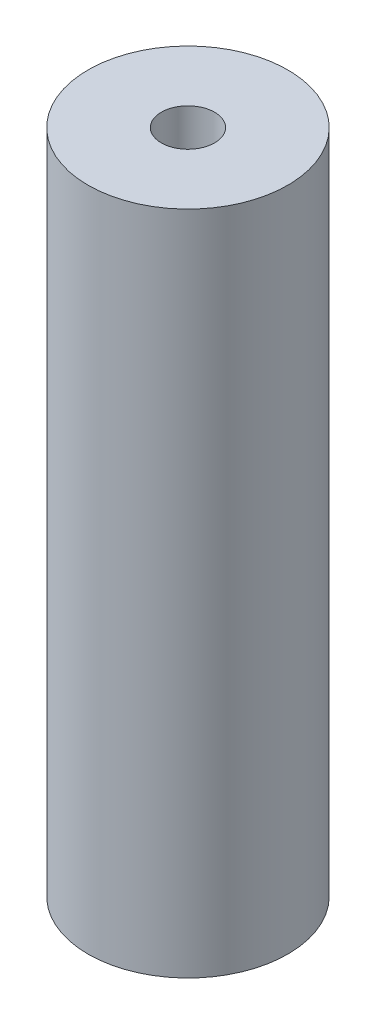
ISO-10303-21;
HEADER;
FILE_DESCRIPTION(('STEP AP214'),'2;1');
FILE_NAME('part.step','',(''),(''),'','','');
FILE_SCHEMA(('AUTOMOTIVE_DESIGN { 1 0 10303 214 1 1 1 1 }'));
ENDSEC;
DATA;
#1=APPLICATION_CONTEXT('core data for automotive mechanical design processes');
#2=APPLICATION_PROTOCOL_DEFINITION('international standard','automotive_design',2000,#1);
#3=PRODUCT_CONTEXT('',#1,'mechanical');
#4=PRODUCT('Part','Part','',(#3));
#5=PRODUCT_RELATED_PRODUCT_CATEGORY('part','',(#4));
#6=PRODUCT_DEFINITION_FORMATION('','',#4);
#7=PRODUCT_DEFINITION_CONTEXT('part definition',#1,'design');
#8=PRODUCT_DEFINITION('design','',#6,#7);
#9=PRODUCT_DEFINITION_SHAPE('','',#8);
#10=(LENGTH_UNIT() NAMED_UNIT(*) SI_UNIT(.MILLI.,.METRE.));
#11=(NAMED_UNIT(*) PLANE_ANGLE_UNIT() SI_UNIT($,.RADIAN.));
#12=(NAMED_UNIT(*) SI_UNIT($,.STERADIAN.) SOLID_ANGLE_UNIT());
#13=UNCERTAINTY_MEASURE_WITH_UNIT(LENGTH_MEASURE(1.E-05),#10,'distance_accuracy_value','');
#14=(GEOMETRIC_REPRESENTATION_CONTEXT(3) GLOBAL_UNCERTAINTY_ASSIGNED_CONTEXT((#13)) GLOBAL_UNIT_ASSIGNED_CONTEXT((#10,
#11,#12)) REPRESENTATION_CONTEXT('',''));
#15=CARTESIAN_POINT('',(0.,0.,0.));
#16=DIRECTION('',(0.,0.,1.));
#17=DIRECTION('',(1.,0.,0.));
#18=AXIS2_PLACEMENT_3D('',#15,#16,#17);
#19=CARTESIAN_POINT('',(0.,0.,0.));
#20=DIRECTION('',(0.,1.,0.));
#21=DIRECTION('',(0.,0.,1.));
#22=AXIS2_PLACEMENT_3D('',#19,#20,#21);
#23=CYLINDRICAL_SURFACE('',#22,3.05);
#24=CARTESIAN_POINT('',(0.,0.,0.));
#25=DIRECTION('',(0.,1.,0.));
#26=DIRECTION('',(0.,0.,1.));
#27=AXIS2_PLACEMENT_3D('',#24,#25,#26);
#28=CIRCLE('',#27,3.05);
#29=CARTESIAN_POINT('',(0.,0.,3.05));
#30=VERTEX_POINT('',#29);
#31=EDGE_CURVE('E51',#30,#30,#28,.T.);
#32=ORIENTED_EDGE('',*,*,#31,.F.);
#33=EDGE_LOOP('',(#32));
#34=FACE_BOUND('',#33,.T.);
#35=CARTESIAN_POINT('',(0.,20.,0.));
#36=DIRECTION('',(0.,1.,0.));
#37=DIRECTION('',(0.,0.,1.));
#38=AXIS2_PLACEMENT_3D('',#35,#36,#37);
#39=CIRCLE('',#38,3.05);
#40=CARTESIAN_POINT('',(0.,20.,3.05));
#41=VERTEX_POINT('',#40);
#42=EDGE_CURVE('E10',#41,#41,#39,.F.);
#43=ORIENTED_EDGE('',*,*,#42,.F.);
#44=EDGE_LOOP('',(#43));
#45=FACE_BOUND('',#44,.T.);
#46=ADVANCED_FACE('F35',(#34,#45),#23,.F.);
#47=CARTESIAN_POINT('',(0.,30.,0.));
#48=DIRECTION('',(0.,-1.,0.));
#49=DIRECTION('',(0.,0.,-1.));
#50=AXIS2_PLACEMENT_3D('',#47,#48,#49);
#51=CYLINDRICAL_SURFACE('',#50,4.5);
#52=CARTESIAN_POINT('',(0.,30.,0.));
#53=DIRECTION('',(0.,1.,0.));
#54=DIRECTION('',(0.,0.,1.));
#55=AXIS2_PLACEMENT_3D('',#52,#53,#54);
#56=CIRCLE('',#55,4.5);
#57=CARTESIAN_POINT('',(0.,30.,4.5));
#58=VERTEX_POINT('',#57);
#59=EDGE_CURVE('E42',#58,#58,#56,.T.);
#60=ORIENTED_EDGE('',*,*,#59,.F.);
#61=EDGE_LOOP('',(#60));
#62=FACE_BOUND('',#61,.T.);
#63=CARTESIAN_POINT('',(0.,0.,0.));
#64=DIRECTION('',(0.,1.,0.));
#65=DIRECTION('',(0.,0.,1.));
#66=AXIS2_PLACEMENT_3D('',#63,#64,#65);
#67=CIRCLE('',#66,4.5);
#68=CARTESIAN_POINT('',(0.,0.,4.5));
#69=VERTEX_POINT('',#68);
#70=EDGE_CURVE('E46',#69,#69,#67,.T.);
#71=ORIENTED_EDGE('',*,*,#70,.T.);
#72=EDGE_LOOP('',(#71));
#73=FACE_BOUND('',#72,.T.);
#74=ADVANCED_FACE('F37',(#62,#73),#51,.T.);
#75=CARTESIAN_POINT('',(0.,30.,0.));
#76=DIRECTION('',(0.,1.,0.));
#77=DIRECTION('',(0.,0.,1.));
#78=AXIS2_PLACEMENT_3D('',#75,#76,#77);
#79=PLANE('',#78);
#80=CARTESIAN_POINT('',(0.,30.,0.));
#81=DIRECTION('',(0.,1.,0.));
#82=DIRECTION('',(0.,0.,1.));
#83=AXIS2_PLACEMENT_3D('',#80,#81,#82);
#84=CIRCLE('',#83,1.2);
#85=CARTESIAN_POINT('',(0.,30.,1.2));
#86=VERTEX_POINT('',#85);
#87=EDGE_CURVE('E56',#86,#86,#84,.T.);
#88=ORIENTED_EDGE('',*,*,#87,.F.);
#89=EDGE_LOOP('',(#88));
#90=FACE_BOUND('',#89,.T.);
#91=ORIENTED_EDGE('',*,*,#59,.T.);
#92=EDGE_LOOP('',(#91));
#93=FACE_BOUND('',#92,.T.);
#94=ADVANCED_FACE('F70',(#90,#93),#79,.T.);
#95=CARTESIAN_POINT('',(0.,0.,0.));
#96=DIRECTION('',(0.,1.,0.));
#97=DIRECTION('',(0.,0.,1.));
#98=AXIS2_PLACEMENT_3D('',#95,#96,#97);
#99=PLANE('',#98);
#100=ORIENTED_EDGE('',*,*,#31,.T.);
#101=EDGE_LOOP('',(#100));
#102=FACE_BOUND('',#101,.T.);
#103=ORIENTED_EDGE('',*,*,#70,.F.);
#104=EDGE_LOOP('',(#103));
#105=FACE_BOUND('',#104,.T.);
#106=ADVANCED_FACE('F72',(#102,#105),#99,.F.);
#107=CARTESIAN_POINT('',(0.,20.,0.));
#108=DIRECTION('',(0.,1.,0.));
#109=DIRECTION('',(0.,0.,1.));
#110=AXIS2_PLACEMENT_3D('',#107,#108,#109);
#111=PLANE('',#110);
#112=CARTESIAN_POINT('',(0.,20.,0.));
#113=DIRECTION('',(0.,1.,0.));
#114=DIRECTION('',(0.,0.,1.));
#115=AXIS2_PLACEMENT_3D('',#112,#113,#114);
#116=CIRCLE('',#115,1.2);
#117=CARTESIAN_POINT('',(0.,20.,1.2));
#118=VERTEX_POINT('',#117);
#119=EDGE_CURVE('E55',#118,#118,#116,.T.);
#120=ORIENTED_EDGE('',*,*,#119,.T.);
#121=EDGE_LOOP('',(#120));
#122=FACE_BOUND('',#121,.T.);
#123=ORIENTED_EDGE('',*,*,#42,.T.);
#124=EDGE_LOOP('',(#123));
#125=FACE_BOUND('',#124,.T.);
#126=ADVANCED_FACE('F62',(#122,#125),#111,.F.);
#127=CARTESIAN_POINT('',(0.,20.,0.));
#128=DIRECTION('',(0.,1.,0.));
#129=DIRECTION('',(0.,0.,1.));
#130=AXIS2_PLACEMENT_3D('',#127,#128,#129);
#131=CYLINDRICAL_SURFACE('',#130,1.2);
#132=ORIENTED_EDGE('',*,*,#119,.F.);
#133=EDGE_LOOP('',(#132));
#134=FACE_BOUND('',#133,.T.);
#135=ORIENTED_EDGE('',*,*,#87,.T.);
#136=EDGE_LOOP('',(#135));
#137=FACE_BOUND('',#136,.T.);
#138=ADVANCED_FACE('F64',(#134,#137),#131,.F.);
#139=CLOSED_SHELL('',(#46,#74,#94,#106,#126,#138));
#140=MANIFOLD_SOLID_BREP('B2',#139);
#141=ADVANCED_BREP_SHAPE_REPRESENTATION('',(#18,#140),#14);
#142=SHAPE_DEFINITION_REPRESENTATION(#9,#141);
ENDSEC;
END-ISO-10303-21;
